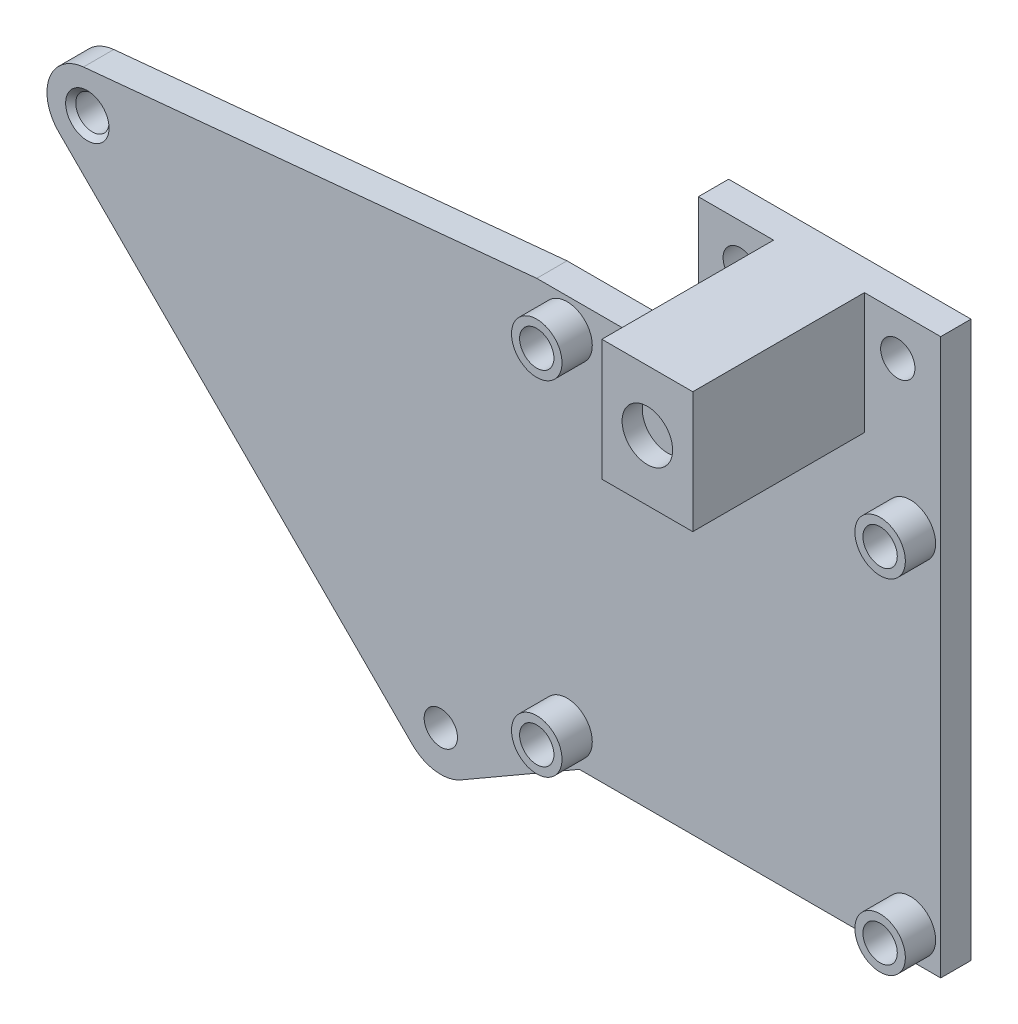
ISO-10303-21;
HEADER;
FILE_DESCRIPTION(('STEP AP214'),'2;1');
FILE_NAME('part.step','',(''),(''),'','','');
FILE_SCHEMA(('AUTOMOTIVE_DESIGN { 1 0 10303 214 1 1 1 1 }'));
ENDSEC;
DATA;
#1=APPLICATION_CONTEXT('core data for automotive mechanical design processes');
#2=APPLICATION_PROTOCOL_DEFINITION('international standard','automotive_design',2000,#1);
#3=PRODUCT_CONTEXT('',#1,'mechanical');
#4=PRODUCT('Part','Part','',(#3));
#5=PRODUCT_RELATED_PRODUCT_CATEGORY('part','',(#4));
#6=PRODUCT_DEFINITION_FORMATION('','',#4);
#7=PRODUCT_DEFINITION_CONTEXT('part definition',#1,'design');
#8=PRODUCT_DEFINITION('design','',#6,#7);
#9=PRODUCT_DEFINITION_SHAPE('','',#8);
#10=(LENGTH_UNIT() NAMED_UNIT(*) SI_UNIT(.MILLI.,.METRE.));
#11=(NAMED_UNIT(*) PLANE_ANGLE_UNIT() SI_UNIT($,.RADIAN.));
#12=(NAMED_UNIT(*) SI_UNIT($,.STERADIAN.) SOLID_ANGLE_UNIT());
#13=UNCERTAINTY_MEASURE_WITH_UNIT(LENGTH_MEASURE(1.E-05),#10,'distance_accuracy_value','');
#14=(GEOMETRIC_REPRESENTATION_CONTEXT(3) GLOBAL_UNCERTAINTY_ASSIGNED_CONTEXT((#13)) GLOBAL_UNIT_ASSIGNED_CONTEXT((#10,
#11,#12)) REPRESENTATION_CONTEXT('',''));
#15=CARTESIAN_POINT('',(0.,0.,0.));
#16=DIRECTION('',(0.,0.,1.));
#17=DIRECTION('',(1.,0.,0.));
#18=AXIS2_PLACEMENT_3D('',#15,#16,#17);
#19=CARTESIAN_POINT('',(-64.5,11.7,3.));
#20=DIRECTION('',(0.,0.,1.));
#21=DIRECTION('',(1.,0.,0.));
#22=AXIS2_PLACEMENT_3D('',#19,#20,#21);
#23=PLANE('',#22);
#24=CARTESIAN_POINT('',(-17.,-17.,3.));
#25=DIRECTION('',(0.,0.,1.));
#26=DIRECTION('',(1.,0.,0.));
#27=AXIS2_PLACEMENT_3D('',#24,#25,#26);
#28=CIRCLE('',#27,2.5);
#29=CARTESIAN_POINT('',(-14.5,-17.,3.));
#30=VERTEX_POINT('',#29);
#31=EDGE_CURVE('E457',#30,#30,#28,.T.);
#32=ORIENTED_EDGE('',*,*,#31,.F.);
#33=EDGE_LOOP('',(#32));
#34=FACE_BOUND('',#33,.T.);
#35=CARTESIAN_POINT('',(-17.,17.,3.));
#36=DIRECTION('',(0.,0.,1.));
#37=DIRECTION('',(1.,0.,0.));
#38=AXIS2_PLACEMENT_3D('',#35,#36,#37);
#39=CIRCLE('',#38,2.5);
#40=CARTESIAN_POINT('',(-14.5,17.,3.));
#41=VERTEX_POINT('',#40);
#42=EDGE_CURVE('E433',#41,#41,#39,.T.);
#43=ORIENTED_EDGE('',*,*,#42,.F.);
#44=EDGE_LOOP('',(#43));
#45=FACE_BOUND('',#44,.T.);
#46=DIRECTION('',(0.,-1.,0.));
#47=VECTOR('',#46,1.);
#48=CARTESIAN_POINT('',(3.45,35.,3.));
#49=LINE('',#48,#47);
#50=CARTESIAN_POINT('',(3.45,35.0000000000001,3.));
#51=VERTEX_POINT('',#50);
#52=CARTESIAN_POINT('',(3.45,23.,3.));
#53=VERTEX_POINT('',#52);
#54=EDGE_CURVE('E60',#51,#53,#49,.T.);
#55=ORIENTED_EDGE('',*,*,#54,.F.);
#56=DIRECTION('',(-1.,0.,0.));
#57=VECTOR('',#56,1.);
#58=CARTESIAN_POINT('',(20.,35.0000000000001,3.));
#59=LINE('',#58,#57);
#60=CARTESIAN_POINT('',(-4.,35.0000000000001,3.));
#61=VERTEX_POINT('',#60);
#62=EDGE_CURVE('E219',#51,#61,#59,.T.);
#63=ORIENTED_EDGE('',*,*,#62,.T.);
#64=DIRECTION('',(0.,-1.,0.));
#65=VECTOR('',#64,1.);
#66=CARTESIAN_POINT('',(-4.,35.0000000000001,3.));
#67=LINE('',#66,#65);
#68=CARTESIAN_POINT('',(-4.,20.,3.));
#69=VERTEX_POINT('',#68);
#70=EDGE_CURVE('E224',#61,#69,#67,.T.);
#71=ORIENTED_EDGE('',*,*,#70,.T.);
#72=DIRECTION('',(-1.,0.,0.));
#73=VECTOR('',#72,1.);
#74=CARTESIAN_POINT('',(-4.,20.,3.));
#75=LINE('',#74,#73);
#76=CARTESIAN_POINT('',(-20.,20.,3.));
#77=VERTEX_POINT('',#76);
#78=EDGE_CURVE('E227',#69,#77,#75,.T.);
#79=ORIENTED_EDGE('',*,*,#78,.T.);
#80=DIRECTION('',(-0.995403311259085,-0.0957718535606834,0.));
#81=VECTOR('',#80,1.);
#82=CARTESIAN_POINT('',(-64.8830874142427,15.6816132450363,3.));
#83=LINE('',#82,#81);
#84=CARTESIAN_POINT('',(-64.8830874142427,15.6816132450363,3.));
#85=VERTEX_POINT('',#84);
#86=EDGE_CURVE('E230',#77,#85,#83,.T.);
#87=ORIENTED_EDGE('',*,*,#86,.T.);
#88=CARTESIAN_POINT('',(-64.5,11.7,3.));
#89=DIRECTION('',(0.,0.,1.));
#90=DIRECTION('',(1.,0.,0.));
#91=AXIS2_PLACEMENT_3D('',#88,#89,#90);
#92=CIRCLE('',#91,4.);
#93=CARTESIAN_POINT('',(-67.3284271247462,8.87157287525381,3.));
#94=VERTEX_POINT('',#93);
#95=EDGE_CURVE('E233',#85,#94,#92,.T.);
#96=ORIENTED_EDGE('',*,*,#95,.T.);
#97=DIRECTION('',(0.707106781186548,-0.707106781186548,0.));
#98=VECTOR('',#97,1.);
#99=CARTESIAN_POINT('',(-67.3284271247462,8.87157287525381,3.));
#100=LINE('',#99,#98);
#101=CARTESIAN_POINT('',(-32.3284271247462,-26.1284271247462,3.));
#102=VERTEX_POINT('',#101);
#103=EDGE_CURVE('E236',#94,#102,#100,.T.);
#104=ORIENTED_EDGE('',*,*,#103,.T.);
#105=CARTESIAN_POINT('',(-29.5,-23.3,3.));
#106=DIRECTION('',(0.,0.,1.));
#107=DIRECTION('',(1.,0.,0.));
#108=AXIS2_PLACEMENT_3D('',#105,#106,#107);
#109=CIRCLE('',#108,4.);
#110=CARTESIAN_POINT('',(-27.5,-26.7641016151378,3.));
#111=VERTEX_POINT('',#110);
#112=EDGE_CURVE('E239',#102,#111,#109,.T.);
#113=ORIENTED_EDGE('',*,*,#112,.T.);
#114=DIRECTION('',(0.866025403784442,0.499999999999995,0.));
#115=VECTOR('',#114,1.);
#116=CARTESIAN_POINT('',(-27.5,-26.7641016151378,3.));
#117=LINE('',#116,#115);
#118=CARTESIAN_POINT('',(-15.7842323350225,-20.,3.));
#119=VERTEX_POINT('',#118);
#120=EDGE_CURVE('E242',#111,#119,#117,.T.);
#121=ORIENTED_EDGE('',*,*,#120,.T.);
#122=DIRECTION('',(1.,0.,0.));
#123=VECTOR('',#122,1.);
#124=CARTESIAN_POINT('',(20.,-20.,3.));
#125=LINE('',#124,#123);
#126=CARTESIAN_POINT('',(20.,-20.,3.));
#127=VERTEX_POINT('',#126);
#128=EDGE_CURVE('E245',#119,#127,#125,.T.);
#129=ORIENTED_EDGE('',*,*,#128,.T.);
#130=DIRECTION('',(0.,1.,0.));
#131=VECTOR('',#130,1.);
#132=CARTESIAN_POINT('',(20.,20.,3.));
#133=LINE('',#132,#131);
#134=CARTESIAN_POINT('',(20.,35.0000000000001,3.));
#135=VERTEX_POINT('',#134);
#136=EDGE_CURVE('E215',#127,#135,#133,.T.);
#137=ORIENTED_EDGE('',*,*,#136,.T.);
#138=CARTESIAN_POINT('',(12.45,35.0000000000001,3.));
#139=VERTEX_POINT('',#138);
#140=EDGE_CURVE('E221',#135,#139,#59,.T.);
#141=ORIENTED_EDGE('',*,*,#140,.T.);
#142=DIRECTION('',(0.,1.,0.));
#143=VECTOR('',#142,1.);
#144=CARTESIAN_POINT('',(12.45,35.,3.));
#145=LINE('',#144,#143);
#146=CARTESIAN_POINT('',(12.45,23.,3.));
#147=VERTEX_POINT('',#146);
#148=EDGE_CURVE('E160',#147,#139,#145,.T.);
#149=ORIENTED_EDGE('',*,*,#148,.F.);
#150=DIRECTION('',(1.,0.,0.));
#151=VECTOR('',#150,1.);
#152=CARTESIAN_POINT('',(3.45,23.,3.));
#153=LINE('',#152,#151);
#154=EDGE_CURVE('E55',#53,#147,#153,.T.);
#155=ORIENTED_EDGE('',*,*,#154,.F.);
#156=EDGE_LOOP('',(#55,#63,#71,#79,#87,#96,#104,#113,#121,#129,#137,#141,#149,#155));
#157=FACE_BOUND('',#156,.T.);
#158=CARTESIAN_POINT('',(-64.5,11.7,3.));
#159=DIRECTION('',(0.,0.,1.));
#160=DIRECTION('',(1.,0.,0.));
#161=AXIS2_PLACEMENT_3D('',#158,#159,#160);
#162=CIRCLE('',#161,2.15000000000001);
#163=CARTESIAN_POINT('',(-62.35,11.7,3.));
#164=VERTEX_POINT('',#163);
#165=EDGE_CURVE('E11',#164,#164,#162,.F.);
#166=ORIENTED_EDGE('',*,*,#165,.T.);
#167=EDGE_LOOP('',(#166));
#168=FACE_BOUND('',#167,.T.);
#169=CARTESIAN_POINT('',(-29.5,-23.3,3.));
#170=DIRECTION('',(0.,0.,1.));
#171=DIRECTION('',(1.,0.,0.));
#172=AXIS2_PLACEMENT_3D('',#169,#170,#171);
#173=CIRCLE('',#172,1.65);
#174=CARTESIAN_POINT('',(-27.85,-23.3,3.));
#175=VERTEX_POINT('',#174);
#176=EDGE_CURVE('E175',#175,#175,#173,.T.);
#177=ORIENTED_EDGE('',*,*,#176,.F.);
#178=EDGE_LOOP('',(#177));
#179=FACE_BOUND('',#178,.T.);
#180=CARTESIAN_POINT('',(0.150000000000001,31.0000000000001,3.));
#181=DIRECTION('',(0.,0.,1.));
#182=DIRECTION('',(1.,0.,0.));
#183=AXIS2_PLACEMENT_3D('',#180,#181,#182);
#184=CIRCLE('',#183,1.7);
#185=CARTESIAN_POINT('',(1.85,31.0000000000001,3.));
#186=VERTEX_POINT('',#185);
#187=EDGE_CURVE('E191',#186,#186,#184,.T.);
#188=ORIENTED_EDGE('',*,*,#187,.F.);
#189=EDGE_LOOP('',(#188));
#190=FACE_BOUND('',#189,.T.);
#191=CARTESIAN_POINT('',(15.75,31.0000000000001,3.));
#192=DIRECTION('',(0.,0.,1.));
#193=DIRECTION('',(1.,0.,0.));
#194=AXIS2_PLACEMENT_3D('',#191,#192,#193);
#195=CIRCLE('',#194,1.7);
#196=CARTESIAN_POINT('',(17.45,31.0000000000001,3.));
#197=VERTEX_POINT('',#196);
#198=EDGE_CURVE('E183',#197,#197,#195,.T.);
#199=ORIENTED_EDGE('',*,*,#198,.F.);
#200=EDGE_LOOP('',(#199));
#201=FACE_BOUND('',#200,.T.);
#202=CARTESIAN_POINT('',(17.,17.,3.));
#203=DIRECTION('',(0.,0.,1.));
#204=DIRECTION('',(1.,0.,0.));
#205=AXIS2_PLACEMENT_3D('',#202,#203,#204);
#206=CIRCLE('',#205,2.5);
#207=CARTESIAN_POINT('',(19.5,17.,3.));
#208=VERTEX_POINT('',#207);
#209=EDGE_CURVE('E445',#208,#208,#206,.T.);
#210=ORIENTED_EDGE('',*,*,#209,.F.);
#211=EDGE_LOOP('',(#210));
#212=FACE_BOUND('',#211,.T.);
#213=CARTESIAN_POINT('',(17.,-17.,3.));
#214=DIRECTION('',(0.,0.,1.));
#215=DIRECTION('',(1.,0.,0.));
#216=AXIS2_PLACEMENT_3D('',#213,#214,#215);
#217=CIRCLE('',#216,2.5);
#218=CARTESIAN_POINT('',(19.5,-17.,3.));
#219=VERTEX_POINT('',#218);
#220=EDGE_CURVE('E469',#219,#219,#217,.T.);
#221=ORIENTED_EDGE('',*,*,#220,.F.);
#222=EDGE_LOOP('',(#221));
#223=FACE_BOUND('',#222,.T.);
#224=ADVANCED_FACE('F39',(#34,#45,#157,#168,#179,#190,#201,#212,#223),#23,.T.);
#225=CARTESIAN_POINT('',(-64.5,11.7,0.));
#226=DIRECTION('',(0.,0.,1.));
#227=DIRECTION('',(1.,0.,0.));
#228=AXIS2_PLACEMENT_3D('',#225,#226,#227);
#229=PLANE('',#228);
#230=DIRECTION('',(-1.,0.,0.));
#231=VECTOR('',#230,1.);
#232=CARTESIAN_POINT('',(20.,35.0000000000001,0.));
#233=LINE('',#232,#231);
#234=CARTESIAN_POINT('',(20.,35.0000000000001,0.));
#235=VERTEX_POINT('',#234);
#236=CARTESIAN_POINT('',(-4.,35.0000000000001,0.));
#237=VERTEX_POINT('',#236);
#238=EDGE_CURVE('E214',#235,#237,#233,.T.);
#239=ORIENTED_EDGE('',*,*,#238,.F.);
#240=DIRECTION('',(0.,1.,0.));
#241=VECTOR('',#240,1.);
#242=CARTESIAN_POINT('',(20.,20.,0.));
#243=LINE('',#242,#241);
#244=CARTESIAN_POINT('',(20.,-20.,0.));
#245=VERTEX_POINT('',#244);
#246=EDGE_CURVE('E220',#245,#235,#243,.T.);
#247=ORIENTED_EDGE('',*,*,#246,.F.);
#248=DIRECTION('',(1.,0.,0.));
#249=VECTOR('',#248,1.);
#250=CARTESIAN_POINT('',(20.,-20.,0.));
#251=LINE('',#250,#249);
#252=CARTESIAN_POINT('',(-15.7842323350225,-20.,0.));
#253=VERTEX_POINT('',#252);
#254=EDGE_CURVE('E273',#253,#245,#251,.T.);
#255=ORIENTED_EDGE('',*,*,#254,.F.);
#256=DIRECTION('',(0.866025403784442,0.499999999999995,0.));
#257=VECTOR('',#256,1.);
#258=CARTESIAN_POINT('',(-27.5,-26.7641016151378,0.));
#259=LINE('',#258,#257);
#260=CARTESIAN_POINT('',(-27.5,-26.7641016151378,0.));
#261=VERTEX_POINT('',#260);
#262=EDGE_CURVE('E270',#261,#253,#259,.T.);
#263=ORIENTED_EDGE('',*,*,#262,.F.);
#264=CARTESIAN_POINT('',(-29.5,-23.3,0.));
#265=DIRECTION('',(0.,0.,1.));
#266=DIRECTION('',(1.,0.,0.));
#267=AXIS2_PLACEMENT_3D('',#264,#265,#266);
#268=CIRCLE('',#267,4.);
#269=CARTESIAN_POINT('',(-32.3284271247462,-26.1284271247462,0.));
#270=VERTEX_POINT('',#269);
#271=EDGE_CURVE('E267',#270,#261,#268,.T.);
#272=ORIENTED_EDGE('',*,*,#271,.F.);
#273=DIRECTION('',(0.707106781186548,-0.707106781186548,0.));
#274=VECTOR('',#273,1.);
#275=CARTESIAN_POINT('',(-67.3284271247462,8.87157287525381,0.));
#276=LINE('',#275,#274);
#277=CARTESIAN_POINT('',(-67.3284271247462,8.87157287525381,0.));
#278=VERTEX_POINT('',#277);
#279=EDGE_CURVE('E264',#278,#270,#276,.T.);
#280=ORIENTED_EDGE('',*,*,#279,.F.);
#281=CARTESIAN_POINT('',(-64.5,11.7,0.));
#282=DIRECTION('',(0.,0.,1.));
#283=DIRECTION('',(1.,0.,0.));
#284=AXIS2_PLACEMENT_3D('',#281,#282,#283);
#285=CIRCLE('',#284,4.);
#286=CARTESIAN_POINT('',(-64.8830874142427,15.6816132450363,0.));
#287=VERTEX_POINT('',#286);
#288=EDGE_CURVE('E261',#287,#278,#285,.T.);
#289=ORIENTED_EDGE('',*,*,#288,.F.);
#290=DIRECTION('',(-0.995403311259085,-0.0957718535606834,0.));
#291=VECTOR('',#290,1.);
#292=CARTESIAN_POINT('',(-64.8830874142427,15.6816132450363,0.));
#293=LINE('',#292,#291);
#294=CARTESIAN_POINT('',(-20.,20.,0.));
#295=VERTEX_POINT('',#294);
#296=EDGE_CURVE('E258',#295,#287,#293,.T.);
#297=ORIENTED_EDGE('',*,*,#296,.F.);
#298=DIRECTION('',(-1.,0.,0.));
#299=VECTOR('',#298,1.);
#300=CARTESIAN_POINT('',(-4.,20.,0.));
#301=LINE('',#300,#299);
#302=CARTESIAN_POINT('',(-4.,20.,0.));
#303=VERTEX_POINT('',#302);
#304=EDGE_CURVE('E255',#303,#295,#301,.T.);
#305=ORIENTED_EDGE('',*,*,#304,.F.);
#306=DIRECTION('',(0.,-1.,0.));
#307=VECTOR('',#306,1.);
#308=CARTESIAN_POINT('',(-4.,35.0000000000001,0.));
#309=LINE('',#308,#307);
#310=EDGE_CURVE('E252',#237,#303,#309,.T.);
#311=ORIENTED_EDGE('',*,*,#310,.F.);
#312=EDGE_LOOP('',(#239,#247,#255,#263,#272,#280,#289,#297,#305,#311));
#313=FACE_BOUND('',#312,.T.);
#314=CARTESIAN_POINT('',(-17.,17.,0.));
#315=DIRECTION('',(0.,0.,1.));
#316=DIRECTION('',(1.,0.,0.));
#317=AXIS2_PLACEMENT_3D('',#314,#315,#316);
#318=CIRCLE('',#317,1.7);
#319=CARTESIAN_POINT('',(-15.3,17.,0.));
#320=VERTEX_POINT('',#319);
#321=EDGE_CURVE('E210',#320,#320,#318,.T.);
#322=ORIENTED_EDGE('',*,*,#321,.T.);
#323=EDGE_LOOP('',(#322));
#324=FACE_BOUND('',#323,.T.);
#325=CARTESIAN_POINT('',(17.,17.,0.));
#326=DIRECTION('',(0.,0.,1.));
#327=DIRECTION('',(1.,0.,0.));
#328=AXIS2_PLACEMENT_3D('',#325,#326,#327);
#329=CIRCLE('',#328,1.7);
#330=CARTESIAN_POINT('',(18.7,17.,0.));
#331=VERTEX_POINT('',#330);
#332=EDGE_CURVE('E206',#331,#331,#329,.T.);
#333=ORIENTED_EDGE('',*,*,#332,.T.);
#334=EDGE_LOOP('',(#333));
#335=FACE_BOUND('',#334,.T.);
#336=CARTESIAN_POINT('',(17.,-17.,0.));
#337=DIRECTION('',(0.,0.,1.));
#338=DIRECTION('',(1.,0.,0.));
#339=AXIS2_PLACEMENT_3D('',#336,#337,#338);
#340=CIRCLE('',#339,1.7);
#341=CARTESIAN_POINT('',(18.7,-17.,0.));
#342=VERTEX_POINT('',#341);
#343=EDGE_CURVE('E202',#342,#342,#340,.T.);
#344=ORIENTED_EDGE('',*,*,#343,.T.);
#345=EDGE_LOOP('',(#344));
#346=FACE_BOUND('',#345,.T.);
#347=CARTESIAN_POINT('',(-17.,-17.,0.));
#348=DIRECTION('',(0.,0.,1.));
#349=DIRECTION('',(1.,0.,0.));
#350=AXIS2_PLACEMENT_3D('',#347,#348,#349);
#351=CIRCLE('',#350,1.7);
#352=CARTESIAN_POINT('',(-15.3,-17.,0.));
#353=VERTEX_POINT('',#352);
#354=EDGE_CURVE('E195',#353,#353,#351,.T.);
#355=ORIENTED_EDGE('',*,*,#354,.T.);
#356=EDGE_LOOP('',(#355));
#357=FACE_BOUND('',#356,.T.);
#358=CARTESIAN_POINT('',(0.150000000000001,31.0000000000001,0.));
#359=DIRECTION('',(0.,0.,1.));
#360=DIRECTION('',(1.,0.,0.));
#361=AXIS2_PLACEMENT_3D('',#358,#359,#360);
#362=CIRCLE('',#361,1.7);
#363=CARTESIAN_POINT('',(1.85,31.0000000000001,0.));
#364=VERTEX_POINT('',#363);
#365=EDGE_CURVE('E187',#364,#364,#362,.T.);
#366=ORIENTED_EDGE('',*,*,#365,.T.);
#367=EDGE_LOOP('',(#366));
#368=FACE_BOUND('',#367,.T.);
#369=CARTESIAN_POINT('',(15.75,31.0000000000001,0.));
#370=DIRECTION('',(0.,0.,1.));
#371=DIRECTION('',(1.,0.,0.));
#372=AXIS2_PLACEMENT_3D('',#369,#370,#371);
#373=CIRCLE('',#372,1.7);
#374=CARTESIAN_POINT('',(17.45,31.0000000000001,0.));
#375=VERTEX_POINT('',#374);
#376=EDGE_CURVE('E179',#375,#375,#373,.T.);
#377=ORIENTED_EDGE('',*,*,#376,.T.);
#378=EDGE_LOOP('',(#377));
#379=FACE_BOUND('',#378,.T.);
#380=CARTESIAN_POINT('',(-29.5,-23.3,0.));
#381=DIRECTION('',(0.,0.,1.));
#382=DIRECTION('',(1.,0.,0.));
#383=AXIS2_PLACEMENT_3D('',#380,#381,#382);
#384=CIRCLE('',#383,1.65);
#385=CARTESIAN_POINT('',(-27.85,-23.3,0.));
#386=VERTEX_POINT('',#385);
#387=EDGE_CURVE('E169',#386,#386,#384,.T.);
#388=ORIENTED_EDGE('',*,*,#387,.T.);
#389=EDGE_LOOP('',(#388));
#390=FACE_BOUND('',#389,.T.);
#391=CARTESIAN_POINT('',(-64.5,11.7,0.));
#392=DIRECTION('',(0.,0.,1.));
#393=DIRECTION('',(1.,0.,0.));
#394=AXIS2_PLACEMENT_3D('',#391,#392,#393);
#395=CIRCLE('',#394,1.65);
#396=CARTESIAN_POINT('',(-62.85,11.7,0.));
#397=VERTEX_POINT('',#396);
#398=EDGE_CURVE('E164',#397,#397,#395,.T.);
#399=ORIENTED_EDGE('',*,*,#398,.T.);
#400=EDGE_LOOP('',(#399));
#401=FACE_BOUND('',#400,.T.);
#402=ADVANCED_FACE('F334',(#313,#324,#335,#346,#357,#368,#379,#390,#401),#229,.F.);
#403=CARTESIAN_POINT('',(20.,35.0000000000001,3.));
#404=DIRECTION('',(0.,-1.,0.));
#405=DIRECTION('',(0.,0.,-1.));
#406=AXIS2_PLACEMENT_3D('',#403,#404,#405);
#407=PLANE('',#406);
#408=ORIENTED_EDGE('',*,*,#238,.T.);
#409=DIRECTION('',(0.,0.,-1.));
#410=VECTOR('',#409,1.);
#411=CARTESIAN_POINT('',(-4.,35.0000000000001,3.));
#412=LINE('',#411,#410);
#413=EDGE_CURVE('E309',#61,#237,#412,.T.);
#414=ORIENTED_EDGE('',*,*,#413,.F.);
#415=ORIENTED_EDGE('',*,*,#62,.F.);
#416=DIRECTION('',(0.,0.,-1.));
#417=VECTOR('',#416,1.);
#418=CARTESIAN_POINT('',(3.45,35.,20.));
#419=LINE('',#418,#417);
#420=CARTESIAN_POINT('',(3.45,35.,20.));
#421=VERTEX_POINT('',#420);
#422=EDGE_CURVE('E407',#421,#51,#419,.T.);
#423=ORIENTED_EDGE('',*,*,#422,.F.);
#424=DIRECTION('',(-1.,0.,0.));
#425=VECTOR('',#424,1.);
#426=CARTESIAN_POINT('',(3.45,35.,20.));
#427=LINE('',#426,#425);
#428=CARTESIAN_POINT('',(12.45,35.,20.));
#429=VERTEX_POINT('',#428);
#430=EDGE_CURVE('E155',#429,#421,#427,.T.);
#431=ORIENTED_EDGE('',*,*,#430,.F.);
#432=DIRECTION('',(0.,0.,-1.));
#433=VECTOR('',#432,1.);
#434=CARTESIAN_POINT('',(12.45,35.,20.));
#435=LINE('',#434,#433);
#436=EDGE_CURVE('E171',#429,#139,#435,.T.);
#437=ORIENTED_EDGE('',*,*,#436,.T.);
#438=ORIENTED_EDGE('',*,*,#140,.F.);
#439=DIRECTION('',(0.,0.,-1.));
#440=VECTOR('',#439,1.);
#441=CARTESIAN_POINT('',(20.,35.0000000000001,3.));
#442=LINE('',#441,#440);
#443=EDGE_CURVE('E313',#135,#235,#442,.T.);
#444=ORIENTED_EDGE('',*,*,#443,.T.);
#445=EDGE_LOOP('',(#408,#414,#415,#423,#431,#437,#438,#444));
#446=FACE_BOUND('',#445,.T.);
#447=ADVANCED_FACE('F340',(#446),#407,.F.);
#448=CARTESIAN_POINT('',(-4.,35.0000000000001,3.));
#449=DIRECTION('',(1.,0.,0.));
#450=DIRECTION('',(0.,1.,0.));
#451=AXIS2_PLACEMENT_3D('',#448,#449,#450);
#452=PLANE('',#451);
#453=ORIENTED_EDGE('',*,*,#310,.T.);
#454=DIRECTION('',(0.,0.,-1.));
#455=VECTOR('',#454,1.);
#456=CARTESIAN_POINT('',(-4.,20.,3.));
#457=LINE('',#456,#455);
#458=EDGE_CURVE('E305',#69,#303,#457,.T.);
#459=ORIENTED_EDGE('',*,*,#458,.F.);
#460=ORIENTED_EDGE('',*,*,#70,.F.);
#461=ORIENTED_EDGE('',*,*,#413,.T.);
#462=EDGE_LOOP('',(#453,#459,#460,#461));
#463=FACE_BOUND('',#462,.T.);
#464=ADVANCED_FACE('F380',(#463),#452,.F.);
#465=CARTESIAN_POINT('',(-4.,20.,3.));
#466=DIRECTION('',(0.,-1.,0.));
#467=DIRECTION('',(0.,0.,-1.));
#468=AXIS2_PLACEMENT_3D('',#465,#466,#467);
#469=PLANE('',#468);
#470=ORIENTED_EDGE('',*,*,#304,.T.);
#471=DIRECTION('',(0.,0.,-1.));
#472=VECTOR('',#471,1.);
#473=CARTESIAN_POINT('',(-20.,20.,3.));
#474=LINE('',#473,#472);
#475=EDGE_CURVE('E301',#77,#295,#474,.T.);
#476=ORIENTED_EDGE('',*,*,#475,.F.);
#477=ORIENTED_EDGE('',*,*,#78,.F.);
#478=ORIENTED_EDGE('',*,*,#458,.T.);
#479=EDGE_LOOP('',(#470,#476,#477,#478));
#480=FACE_BOUND('',#479,.T.);
#481=ADVANCED_FACE('F376',(#480),#469,.F.);
#482=CARTESIAN_POINT('',(-64.8830874142427,15.6816132450363,3.));
#483=DIRECTION('',(0.0957718535606833,-0.995403311259085,0.));
#484=DIRECTION('',(0.995403311259085,0.0957718535606834,0.));
#485=AXIS2_PLACEMENT_3D('',#482,#483,#484);
#486=PLANE('',#485);
#487=ORIENTED_EDGE('',*,*,#296,.T.);
#488=DIRECTION('',(0.,0.,-1.));
#489=VECTOR('',#488,1.);
#490=CARTESIAN_POINT('',(-64.8830874142427,15.6816132450363,3.));
#491=LINE('',#490,#489);
#492=EDGE_CURVE('E297',#85,#287,#491,.T.);
#493=ORIENTED_EDGE('',*,*,#492,.F.);
#494=ORIENTED_EDGE('',*,*,#86,.F.);
#495=ORIENTED_EDGE('',*,*,#475,.T.);
#496=EDGE_LOOP('',(#487,#493,#494,#495));
#497=FACE_BOUND('',#496,.T.);
#498=ADVANCED_FACE('F372',(#497),#486,.F.);
#499=CARTESIAN_POINT('',(-64.5,11.7,3.));
#500=DIRECTION('',(0.,0.,-1.));
#501=DIRECTION('',(-1.,0.,0.));
#502=AXIS2_PLACEMENT_3D('',#499,#500,#501);
#503=CYLINDRICAL_SURFACE('',#502,4.);
#504=ORIENTED_EDGE('',*,*,#288,.T.);
#505=DIRECTION('',(0.,0.,-1.));
#506=VECTOR('',#505,1.);
#507=CARTESIAN_POINT('',(-67.3284271247462,8.87157287525381,3.));
#508=LINE('',#507,#506);
#509=EDGE_CURVE('E293',#94,#278,#508,.T.);
#510=ORIENTED_EDGE('',*,*,#509,.F.);
#511=ORIENTED_EDGE('',*,*,#95,.F.);
#512=ORIENTED_EDGE('',*,*,#492,.T.);
#513=EDGE_LOOP('',(#504,#510,#511,#512));
#514=FACE_BOUND('',#513,.T.);
#515=ADVANCED_FACE('F368',(#514),#503,.T.);
#516=CARTESIAN_POINT('',(-67.3284271247462,8.87157287525381,3.));
#517=DIRECTION('',(0.707106781186547,0.707106781186547,0.));
#518=DIRECTION('',(-0.707106781186548,0.707106781186548,0.));
#519=AXIS2_PLACEMENT_3D('',#516,#517,#518);
#520=PLANE('',#519);
#521=ORIENTED_EDGE('',*,*,#279,.T.);
#522=DIRECTION('',(0.,0.,-1.));
#523=VECTOR('',#522,1.);
#524=CARTESIAN_POINT('',(-32.3284271247462,-26.1284271247462,3.));
#525=LINE('',#524,#523);
#526=EDGE_CURVE('E289',#102,#270,#525,.T.);
#527=ORIENTED_EDGE('',*,*,#526,.F.);
#528=ORIENTED_EDGE('',*,*,#103,.F.);
#529=ORIENTED_EDGE('',*,*,#509,.T.);
#530=EDGE_LOOP('',(#521,#527,#528,#529));
#531=FACE_BOUND('',#530,.T.);
#532=ADVANCED_FACE('F364',(#531),#520,.F.);
#533=CARTESIAN_POINT('',(-29.5,-23.3,3.));
#534=DIRECTION('',(0.,0.,-1.));
#535=DIRECTION('',(-1.,0.,0.));
#536=AXIS2_PLACEMENT_3D('',#533,#534,#535);
#537=CYLINDRICAL_SURFACE('',#536,4.);
#538=ORIENTED_EDGE('',*,*,#271,.T.);
#539=DIRECTION('',(0.,0.,-1.));
#540=VECTOR('',#539,1.);
#541=CARTESIAN_POINT('',(-27.5,-26.7641016151378,3.));
#542=LINE('',#541,#540);
#543=EDGE_CURVE('E285',#111,#261,#542,.T.);
#544=ORIENTED_EDGE('',*,*,#543,.F.);
#545=ORIENTED_EDGE('',*,*,#112,.F.);
#546=ORIENTED_EDGE('',*,*,#526,.T.);
#547=EDGE_LOOP('',(#538,#544,#545,#546));
#548=FACE_BOUND('',#547,.T.);
#549=ADVANCED_FACE('F360',(#548),#537,.T.);
#550=CARTESIAN_POINT('',(-27.5,-26.7641016151378,3.));
#551=DIRECTION('',(-0.499999999999995,0.866025403784441,0.));
#552=DIRECTION('',(-0.866025403784442,-0.499999999999995,0.));
#553=AXIS2_PLACEMENT_3D('',#550,#551,#552);
#554=PLANE('',#553);
#555=ORIENTED_EDGE('',*,*,#262,.T.);
#556=DIRECTION('',(0.,0.,-1.));
#557=VECTOR('',#556,1.);
#558=CARTESIAN_POINT('',(-15.7842323350225,-20.,3.));
#559=LINE('',#558,#557);
#560=EDGE_CURVE('E281',#119,#253,#559,.T.);
#561=ORIENTED_EDGE('',*,*,#560,.F.);
#562=ORIENTED_EDGE('',*,*,#120,.F.);
#563=ORIENTED_EDGE('',*,*,#543,.T.);
#564=EDGE_LOOP('',(#555,#561,#562,#563));
#565=FACE_BOUND('',#564,.T.);
#566=ADVANCED_FACE('F356',(#565),#554,.F.);
#567=CARTESIAN_POINT('',(20.,-20.,3.));
#568=DIRECTION('',(0.,1.,0.));
#569=DIRECTION('',(-1.,0.,0.));
#570=AXIS2_PLACEMENT_3D('',#567,#568,#569);
#571=PLANE('',#570);
#572=ORIENTED_EDGE('',*,*,#254,.T.);
#573=DIRECTION('',(0.,0.,-1.));
#574=VECTOR('',#573,1.);
#575=CARTESIAN_POINT('',(20.,-20.,3.));
#576=LINE('',#575,#574);
#577=EDGE_CURVE('E249',#127,#245,#576,.T.);
#578=ORIENTED_EDGE('',*,*,#577,.F.);
#579=ORIENTED_EDGE('',*,*,#128,.F.);
#580=ORIENTED_EDGE('',*,*,#560,.T.);
#581=EDGE_LOOP('',(#572,#578,#579,#580));
#582=FACE_BOUND('',#581,.T.);
#583=ADVANCED_FACE('F352',(#582),#571,.F.);
#584=CARTESIAN_POINT('',(20.,20.,3.));
#585=DIRECTION('',(-1.,0.,0.));
#586=DIRECTION('',(0.,0.,1.));
#587=AXIS2_PLACEMENT_3D('',#584,#585,#586);
#588=PLANE('',#587);
#589=ORIENTED_EDGE('',*,*,#246,.T.);
#590=ORIENTED_EDGE('',*,*,#443,.F.);
#591=ORIENTED_EDGE('',*,*,#136,.F.);
#592=ORIENTED_EDGE('',*,*,#577,.T.);
#593=EDGE_LOOP('',(#589,#590,#591,#592));
#594=FACE_BOUND('',#593,.T.);
#595=ADVANCED_FACE('F349',(#594),#588,.F.);
#596=CARTESIAN_POINT('',(-17.,17.,3.));
#597=DIRECTION('',(0.,0.,-1.));
#598=DIRECTION('',(-1.,0.,0.));
#599=AXIS2_PLACEMENT_3D('',#596,#597,#598);
#600=CYLINDRICAL_SURFACE('',#599,1.7);
#601=ORIENTED_EDGE('',*,*,#321,.F.);
#602=EDGE_LOOP('',(#601));
#603=FACE_BOUND('',#602,.T.);
#604=CARTESIAN_POINT('',(-17.,17.,6.));
#605=DIRECTION('',(0.,0.,1.));
#606=DIRECTION('',(1.,0.,0.));
#607=AXIS2_PLACEMENT_3D('',#604,#605,#606);
#608=CIRCLE('',#607,1.7);
#609=CARTESIAN_POINT('',(-15.3,17.,6.));
#610=VERTEX_POINT('',#609);
#611=EDGE_CURVE('E437',#610,#610,#608,.T.);
#612=ORIENTED_EDGE('',*,*,#611,.T.);
#613=EDGE_LOOP('',(#612));
#614=FACE_BOUND('',#613,.T.);
#615=ADVANCED_FACE('F346',(#603,#614),#600,.F.);
#616=CARTESIAN_POINT('',(17.,17.,3.));
#617=DIRECTION('',(0.,0.,-1.));
#618=DIRECTION('',(-1.,0.,0.));
#619=AXIS2_PLACEMENT_3D('',#616,#617,#618);
#620=CYLINDRICAL_SURFACE('',#619,1.7);
#621=ORIENTED_EDGE('',*,*,#332,.F.);
#622=EDGE_LOOP('',(#621));
#623=FACE_BOUND('',#622,.T.);
#624=CARTESIAN_POINT('',(17.,17.,6.));
#625=DIRECTION('',(0.,0.,1.));
#626=DIRECTION('',(1.,0.,0.));
#627=AXIS2_PLACEMENT_3D('',#624,#625,#626);
#628=CIRCLE('',#627,1.7);
#629=CARTESIAN_POINT('',(18.7,17.,6.));
#630=VERTEX_POINT('',#629);
#631=EDGE_CURVE('E449',#630,#630,#628,.T.);
#632=ORIENTED_EDGE('',*,*,#631,.T.);
#633=EDGE_LOOP('',(#632));
#634=FACE_BOUND('',#633,.T.);
#635=ADVANCED_FACE('F551',(#623,#634),#620,.F.);
#636=CARTESIAN_POINT('',(17.,-17.,3.));
#637=DIRECTION('',(0.,0.,-1.));
#638=DIRECTION('',(-1.,0.,0.));
#639=AXIS2_PLACEMENT_3D('',#636,#637,#638);
#640=CYLINDRICAL_SURFACE('',#639,1.7);
#641=ORIENTED_EDGE('',*,*,#343,.F.);
#642=EDGE_LOOP('',(#641));
#643=FACE_BOUND('',#642,.T.);
#644=CARTESIAN_POINT('',(17.,-17.,6.));
#645=DIRECTION('',(0.,0.,1.));
#646=DIRECTION('',(1.,0.,0.));
#647=AXIS2_PLACEMENT_3D('',#644,#645,#646);
#648=CIRCLE('',#647,1.7);
#649=CARTESIAN_POINT('',(18.7,-17.,6.));
#650=VERTEX_POINT('',#649);
#651=EDGE_CURVE('E473',#650,#650,#648,.T.);
#652=ORIENTED_EDGE('',*,*,#651,.T.);
#653=EDGE_LOOP('',(#652));
#654=FACE_BOUND('',#653,.T.);
#655=ADVANCED_FACE('F481',(#643,#654),#640,.F.);
#656=CARTESIAN_POINT('',(-17.,-17.,3.));
#657=DIRECTION('',(0.,0.,-1.));
#658=DIRECTION('',(-1.,0.,0.));
#659=AXIS2_PLACEMENT_3D('',#656,#657,#658);
#660=CYLINDRICAL_SURFACE('',#659,1.7);
#661=ORIENTED_EDGE('',*,*,#354,.F.);
#662=EDGE_LOOP('',(#661));
#663=FACE_BOUND('',#662,.T.);
#664=CARTESIAN_POINT('',(-17.,-17.,6.));
#665=DIRECTION('',(0.,0.,1.));
#666=DIRECTION('',(1.,0.,0.));
#667=AXIS2_PLACEMENT_3D('',#664,#665,#666);
#668=CIRCLE('',#667,1.7);
#669=CARTESIAN_POINT('',(-15.3,-17.,6.));
#670=VERTEX_POINT('',#669);
#671=EDGE_CURVE('E461',#670,#670,#668,.T.);
#672=ORIENTED_EDGE('',*,*,#671,.T.);
#673=EDGE_LOOP('',(#672));
#674=FACE_BOUND('',#673,.T.);
#675=ADVANCED_FACE('F545',(#663,#674),#660,.F.);
#676=CARTESIAN_POINT('',(0.150000000000001,31.0000000000001,3.));
#677=DIRECTION('',(0.,0.,-1.));
#678=DIRECTION('',(-1.,0.,0.));
#679=AXIS2_PLACEMENT_3D('',#676,#677,#678);
#680=CYLINDRICAL_SURFACE('',#679,1.7);
#681=ORIENTED_EDGE('',*,*,#187,.T.);
#682=EDGE_LOOP('',(#681));
#683=FACE_BOUND('',#682,.T.);
#684=ORIENTED_EDGE('',*,*,#365,.F.);
#685=EDGE_LOOP('',(#684));
#686=FACE_BOUND('',#685,.T.);
#687=ADVANCED_FACE('F541',(#683,#686),#680,.F.);
#688=CARTESIAN_POINT('',(15.75,31.0000000000001,3.));
#689=DIRECTION('',(0.,0.,-1.));
#690=DIRECTION('',(-1.,0.,0.));
#691=AXIS2_PLACEMENT_3D('',#688,#689,#690);
#692=CYLINDRICAL_SURFACE('',#691,1.7);
#693=ORIENTED_EDGE('',*,*,#198,.T.);
#694=EDGE_LOOP('',(#693));
#695=FACE_BOUND('',#694,.T.);
#696=ORIENTED_EDGE('',*,*,#376,.F.);
#697=EDGE_LOOP('',(#696));
#698=FACE_BOUND('',#697,.T.);
#699=ADVANCED_FACE('F537',(#695,#698),#692,.F.);
#700=CARTESIAN_POINT('',(-29.5,-23.3,3.));
#701=DIRECTION('',(0.,0.,-1.));
#702=DIRECTION('',(-1.,0.,0.));
#703=AXIS2_PLACEMENT_3D('',#700,#701,#702);
#704=CYLINDRICAL_SURFACE('',#703,1.65);
#705=ORIENTED_EDGE('',*,*,#176,.T.);
#706=EDGE_LOOP('',(#705));
#707=FACE_BOUND('',#706,.T.);
#708=ORIENTED_EDGE('',*,*,#387,.F.);
#709=EDGE_LOOP('',(#708));
#710=FACE_BOUND('',#709,.T.);
#711=ADVANCED_FACE('F330',(#707,#710),#704,.F.);
#712=CARTESIAN_POINT('',(-64.5,11.7,3.));
#713=DIRECTION('',(0.,0.,-1.));
#714=DIRECTION('',(-1.,0.,0.));
#715=AXIS2_PLACEMENT_3D('',#712,#713,#714);
#716=CYLINDRICAL_SURFACE('',#715,1.65);
#717=CARTESIAN_POINT('',(-64.5,11.7,2.49999999999998));
#718=DIRECTION('',(0.,0.,1.));
#719=DIRECTION('',(1.,0.,0.));
#720=AXIS2_PLACEMENT_3D('',#717,#718,#719);
#721=CIRCLE('',#720,1.65);
#722=CARTESIAN_POINT('',(-62.85,11.7,2.49999999999998));
#723=VERTEX_POINT('',#722);
#724=EDGE_CURVE('E48',#723,#723,#721,.T.);
#725=ORIENTED_EDGE('',*,*,#724,.T.);
#726=EDGE_LOOP('',(#725));
#727=FACE_BOUND('',#726,.T.);
#728=ORIENTED_EDGE('',*,*,#398,.F.);
#729=EDGE_LOOP('',(#728));
#730=FACE_BOUND('',#729,.T.);
#731=ADVANCED_FACE('F320',(#727,#730),#716,.F.);
#732=CARTESIAN_POINT('',(-64.5,11.7,2.49999999999998));
#733=DIRECTION('',(0.,0.,1.));
#734=DIRECTION('',(1.,0.,0.));
#735=AXIS2_PLACEMENT_3D('',#732,#733,#734);
#736=CONICAL_SURFACE('',#735,1.65,0.785398163397443);
#737=ORIENTED_EDGE('',*,*,#165,.F.);
#738=EDGE_LOOP('',(#737));
#739=FACE_BOUND('',#738,.T.);
#740=ORIENTED_EDGE('',*,*,#724,.F.);
#741=EDGE_LOOP('',(#740));
#742=FACE_BOUND('',#741,.T.);
#743=ADVANCED_FACE('F41',(#739,#742),#736,.F.);
#744=CARTESIAN_POINT('',(3.45,35.,20.));
#745=DIRECTION('',(1.,0.,0.));
#746=DIRECTION('',(0.,1.,0.));
#747=AXIS2_PLACEMENT_3D('',#744,#745,#746);
#748=PLANE('',#747);
#749=ORIENTED_EDGE('',*,*,#54,.T.);
#750=DIRECTION('',(0.,0.,-1.));
#751=VECTOR('',#750,1.);
#752=CARTESIAN_POINT('',(3.45,23.,20.));
#753=LINE('',#752,#751);
#754=CARTESIAN_POINT('',(3.45,23.,20.));
#755=VERTEX_POINT('',#754);
#756=EDGE_CURVE('E143',#755,#53,#753,.T.);
#757=ORIENTED_EDGE('',*,*,#756,.F.);
#758=DIRECTION('',(0.,-1.,0.));
#759=VECTOR('',#758,1.);
#760=CARTESIAN_POINT('',(3.45,35.,20.));
#761=LINE('',#760,#759);
#762=EDGE_CURVE('E150',#421,#755,#761,.T.);
#763=ORIENTED_EDGE('',*,*,#762,.F.);
#764=ORIENTED_EDGE('',*,*,#422,.T.);
#765=EDGE_LOOP('',(#749,#757,#763,#764));
#766=FACE_BOUND('',#765,.T.);
#767=ADVANCED_FACE('F162',(#766),#748,.F.);
#768=CARTESIAN_POINT('',(3.45,23.,20.));
#769=DIRECTION('',(0.,1.,0.));
#770=DIRECTION('',(0.,0.,1.));
#771=AXIS2_PLACEMENT_3D('',#768,#769,#770);
#772=PLANE('',#771);
#773=ORIENTED_EDGE('',*,*,#154,.T.);
#774=DIRECTION('',(0.,0.,-1.));
#775=VECTOR('',#774,1.);
#776=CARTESIAN_POINT('',(12.45,23.,20.));
#777=LINE('',#776,#775);
#778=CARTESIAN_POINT('',(12.45,23.,20.));
#779=VERTEX_POINT('',#778);
#780=EDGE_CURVE('E145',#779,#147,#777,.T.);
#781=ORIENTED_EDGE('',*,*,#780,.F.);
#782=DIRECTION('',(1.,0.,0.));
#783=VECTOR('',#782,1.);
#784=CARTESIAN_POINT('',(3.45,23.,20.));
#785=LINE('',#784,#783);
#786=EDGE_CURVE('E139',#755,#779,#785,.T.);
#787=ORIENTED_EDGE('',*,*,#786,.F.);
#788=ORIENTED_EDGE('',*,*,#756,.T.);
#789=EDGE_LOOP('',(#773,#781,#787,#788));
#790=FACE_BOUND('',#789,.T.);
#791=ADVANCED_FACE('F141',(#790),#772,.F.);
#792=CARTESIAN_POINT('',(12.45,35.,20.));
#793=DIRECTION('',(-1.,0.,0.));
#794=DIRECTION('',(0.,-1.,0.));
#795=AXIS2_PLACEMENT_3D('',#792,#793,#794);
#796=PLANE('',#795);
#797=ORIENTED_EDGE('',*,*,#148,.T.);
#798=ORIENTED_EDGE('',*,*,#436,.F.);
#799=DIRECTION('',(0.,1.,0.));
#800=VECTOR('',#799,1.);
#801=CARTESIAN_POINT('',(12.45,35.,20.));
#802=LINE('',#801,#800);
#803=EDGE_CURVE('E149',#779,#429,#802,.T.);
#804=ORIENTED_EDGE('',*,*,#803,.F.);
#805=ORIENTED_EDGE('',*,*,#780,.T.);
#806=EDGE_LOOP('',(#797,#798,#804,#805));
#807=FACE_BOUND('',#806,.T.);
#808=ADVANCED_FACE('F528',(#807),#796,.F.);
#809=CARTESIAN_POINT('',(0.,0.,20.));
#810=DIRECTION('',(0.,0.,1.));
#811=DIRECTION('',(1.,0.,0.));
#812=AXIS2_PLACEMENT_3D('',#809,#810,#811);
#813=PLANE('',#812);
#814=CARTESIAN_POINT('',(7.95,29.,20.));
#815=DIRECTION('',(0.,0.,1.));
#816=DIRECTION('',(1.,0.,0.));
#817=AXIS2_PLACEMENT_3D('',#814,#815,#816);
#818=CIRCLE('',#817,2.5);
#819=CARTESIAN_POINT('',(10.45,29.,20.));
#820=VERTEX_POINT('',#819);
#821=EDGE_CURVE('E425',#820,#820,#818,.T.);
#822=ORIENTED_EDGE('',*,*,#821,.F.);
#823=EDGE_LOOP('',(#822));
#824=FACE_BOUND('',#823,.T.);
#825=ORIENTED_EDGE('',*,*,#762,.T.);
#826=ORIENTED_EDGE('',*,*,#786,.T.);
#827=ORIENTED_EDGE('',*,*,#803,.T.);
#828=ORIENTED_EDGE('',*,*,#430,.T.);
#829=EDGE_LOOP('',(#825,#826,#827,#828));
#830=FACE_BOUND('',#829,.T.);
#831=ADVANCED_FACE('F153',(#824,#830),#813,.T.);
#832=CARTESIAN_POINT('',(7.95,29.,18.));
#833=DIRECTION('',(0.,0.,1.));
#834=DIRECTION('',(1.,0.,0.));
#835=AXIS2_PLACEMENT_3D('',#832,#833,#834);
#836=CYLINDRICAL_SURFACE('',#835,2.5);
#837=CARTESIAN_POINT('',(7.95,29.,18.));
#838=DIRECTION('',(0.,0.,1.));
#839=DIRECTION('',(1.,0.,0.));
#840=AXIS2_PLACEMENT_3D('',#837,#838,#839);
#841=CIRCLE('',#840,2.5);
#842=CARTESIAN_POINT('',(10.45,29.,18.));
#843=VERTEX_POINT('',#842);
#844=EDGE_CURVE('E421',#843,#843,#841,.T.);
#845=ORIENTED_EDGE('',*,*,#844,.F.);
#846=EDGE_LOOP('',(#845));
#847=FACE_BOUND('',#846,.T.);
#848=ORIENTED_EDGE('',*,*,#821,.T.);
#849=EDGE_LOOP('',(#848));
#850=FACE_BOUND('',#849,.T.);
#851=ADVANCED_FACE('F521',(#847,#850),#836,.F.);
#852=CARTESIAN_POINT('',(7.95,29.,18.));
#853=DIRECTION('',(0.,0.,1.));
#854=DIRECTION('',(1.,0.,0.));
#855=AXIS2_PLACEMENT_3D('',#852,#853,#854);
#856=PLANE('',#855);
#857=ORIENTED_EDGE('',*,*,#844,.T.);
#858=EDGE_LOOP('',(#857));
#859=FACE_BOUND('',#858,.T.);
#860=ADVANCED_FACE('F514',(#859),#856,.T.);
#861=CARTESIAN_POINT('',(-17.,17.,6.));
#862=DIRECTION('',(0.,0.,1.));
#863=DIRECTION('',(1.,0.,0.));
#864=AXIS2_PLACEMENT_3D('',#861,#862,#863);
#865=PLANE('',#864);
#866=CARTESIAN_POINT('',(-17.,17.,6.));
#867=DIRECTION('',(0.,0.,1.));
#868=DIRECTION('',(1.,0.,0.));
#869=AXIS2_PLACEMENT_3D('',#866,#867,#868);
#870=CIRCLE('',#869,2.5);
#871=CARTESIAN_POINT('',(-14.5,17.,6.));
#872=VERTEX_POINT('',#871);
#873=EDGE_CURVE('E429',#872,#872,#870,.T.);
#874=ORIENTED_EDGE('',*,*,#873,.T.);
#875=EDGE_LOOP('',(#874));
#876=FACE_BOUND('',#875,.T.);
#877=ORIENTED_EDGE('',*,*,#611,.F.);
#878=EDGE_LOOP('',(#877));
#879=FACE_BOUND('',#878,.T.);
#880=ADVANCED_FACE('F511',(#876,#879),#865,.T.);
#881=CARTESIAN_POINT('',(-17.,17.,6.));
#882=DIRECTION('',(0.,0.,-1.));
#883=DIRECTION('',(-1.,0.,0.));
#884=AXIS2_PLACEMENT_3D('',#881,#882,#883);
#885=CYLINDRICAL_SURFACE('',#884,2.5);
#886=ORIENTED_EDGE('',*,*,#873,.F.);
#887=EDGE_LOOP('',(#886));
#888=FACE_BOUND('',#887,.T.);
#889=ORIENTED_EDGE('',*,*,#42,.T.);
#890=EDGE_LOOP('',(#889));
#891=FACE_BOUND('',#890,.T.);
#892=ADVANCED_FACE('F506',(#888,#891),#885,.T.);
#893=CARTESIAN_POINT('',(17.,17.,6.));
#894=DIRECTION('',(0.,0.,1.));
#895=DIRECTION('',(1.,0.,0.));
#896=AXIS2_PLACEMENT_3D('',#893,#894,#895);
#897=PLANE('',#896);
#898=CARTESIAN_POINT('',(17.,17.,6.));
#899=DIRECTION('',(0.,0.,1.));
#900=DIRECTION('',(1.,0.,0.));
#901=AXIS2_PLACEMENT_3D('',#898,#899,#900);
#902=CIRCLE('',#901,2.5);
#903=CARTESIAN_POINT('',(19.5,17.,6.));
#904=VERTEX_POINT('',#903);
#905=EDGE_CURVE('E444',#904,#904,#902,.T.);
#906=ORIENTED_EDGE('',*,*,#905,.T.);
#907=EDGE_LOOP('',(#906));
#908=FACE_BOUND('',#907,.T.);
#909=ORIENTED_EDGE('',*,*,#631,.F.);
#910=EDGE_LOOP('',(#909));
#911=FACE_BOUND('',#910,.T.);
#912=ADVANCED_FACE('F503',(#908,#911),#897,.T.);
#913=CARTESIAN_POINT('',(17.,17.,6.));
#914=DIRECTION('',(0.,0.,-1.));
#915=DIRECTION('',(-1.,0.,0.));
#916=AXIS2_PLACEMENT_3D('',#913,#914,#915);
#917=CYLINDRICAL_SURFACE('',#916,2.5);
#918=ORIENTED_EDGE('',*,*,#905,.F.);
#919=EDGE_LOOP('',(#918));
#920=FACE_BOUND('',#919,.T.);
#921=ORIENTED_EDGE('',*,*,#209,.T.);
#922=EDGE_LOOP('',(#921));
#923=FACE_BOUND('',#922,.T.);
#924=ADVANCED_FACE('F500',(#920,#923),#917,.T.);
#925=CARTESIAN_POINT('',(-17.,-17.,6.));
#926=DIRECTION('',(0.,0.,1.));
#927=DIRECTION('',(1.,0.,0.));
#928=AXIS2_PLACEMENT_3D('',#925,#926,#927);
#929=PLANE('',#928);
#930=CARTESIAN_POINT('',(-17.,-17.,6.));
#931=DIRECTION('',(0.,0.,1.));
#932=DIRECTION('',(1.,0.,0.));
#933=AXIS2_PLACEMENT_3D('',#930,#931,#932);
#934=CIRCLE('',#933,2.5);
#935=CARTESIAN_POINT('',(-14.5,-17.,6.));
#936=VERTEX_POINT('',#935);
#937=EDGE_CURVE('E456',#936,#936,#934,.T.);
#938=ORIENTED_EDGE('',*,*,#937,.T.);
#939=EDGE_LOOP('',(#938));
#940=FACE_BOUND('',#939,.T.);
#941=ORIENTED_EDGE('',*,*,#671,.F.);
#942=EDGE_LOOP('',(#941));
#943=FACE_BOUND('',#942,.T.);
#944=ADVANCED_FACE('F495',(#940,#943),#929,.T.);
#945=CARTESIAN_POINT('',(-17.,-17.,6.));
#946=DIRECTION('',(0.,0.,-1.));
#947=DIRECTION('',(-1.,0.,0.));
#948=AXIS2_PLACEMENT_3D('',#945,#946,#947);
#949=CYLINDRICAL_SURFACE('',#948,2.5);
#950=ORIENTED_EDGE('',*,*,#937,.F.);
#951=EDGE_LOOP('',(#950));
#952=FACE_BOUND('',#951,.T.);
#953=ORIENTED_EDGE('',*,*,#31,.T.);
#954=EDGE_LOOP('',(#953));
#955=FACE_BOUND('',#954,.T.);
#956=ADVANCED_FACE('F486',(#952,#955),#949,.T.);
#957=CARTESIAN_POINT('',(17.,-17.,6.));
#958=DIRECTION('',(0.,0.,1.));
#959=DIRECTION('',(1.,0.,0.));
#960=AXIS2_PLACEMENT_3D('',#957,#958,#959);
#961=PLANE('',#960);
#962=CARTESIAN_POINT('',(17.,-17.,6.));
#963=DIRECTION('',(0.,0.,1.));
#964=DIRECTION('',(1.,0.,0.));
#965=AXIS2_PLACEMENT_3D('',#962,#963,#964);
#966=CIRCLE('',#965,2.5);
#967=CARTESIAN_POINT('',(19.5,-17.,6.));
#968=VERTEX_POINT('',#967);
#969=EDGE_CURVE('E468',#968,#968,#966,.T.);
#970=ORIENTED_EDGE('',*,*,#969,.T.);
#971=EDGE_LOOP('',(#970));
#972=FACE_BOUND('',#971,.T.);
#973=ORIENTED_EDGE('',*,*,#651,.F.);
#974=EDGE_LOOP('',(#973));
#975=FACE_BOUND('',#974,.T.);
#976=ADVANCED_FACE('F483',(#972,#975),#961,.T.);
#977=CARTESIAN_POINT('',(17.,-17.,6.));
#978=DIRECTION('',(0.,0.,-1.));
#979=DIRECTION('',(-1.,0.,0.));
#980=AXIS2_PLACEMENT_3D('',#977,#978,#979);
#981=CYLINDRICAL_SURFACE('',#980,2.5);
#982=ORIENTED_EDGE('',*,*,#969,.F.);
#983=EDGE_LOOP('',(#982));
#984=FACE_BOUND('',#983,.T.);
#985=ORIENTED_EDGE('',*,*,#220,.T.);
#986=EDGE_LOOP('',(#985));
#987=FACE_BOUND('',#986,.T.);
#988=ADVANCED_FACE('F485',(#984,#987),#981,.T.);
#989=CLOSED_SHELL('',(#224,#402,#447,#464,#481,#498,#515,#532,#549,#566,#583,#595,#615,#635,
#655,#675,#687,#699,#711,#731,#743,#767,#791,#808,#831,#851,#860,#880,#892,#912,#924,#944,#956,
#976,#988));
#990=MANIFOLD_SOLID_BREP('B2',#989);
#991=ADVANCED_BREP_SHAPE_REPRESENTATION('',(#18,#990),#14);
#992=SHAPE_DEFINITION_REPRESENTATION(#9,#991);
ENDSEC;
END-ISO-10303-21;
